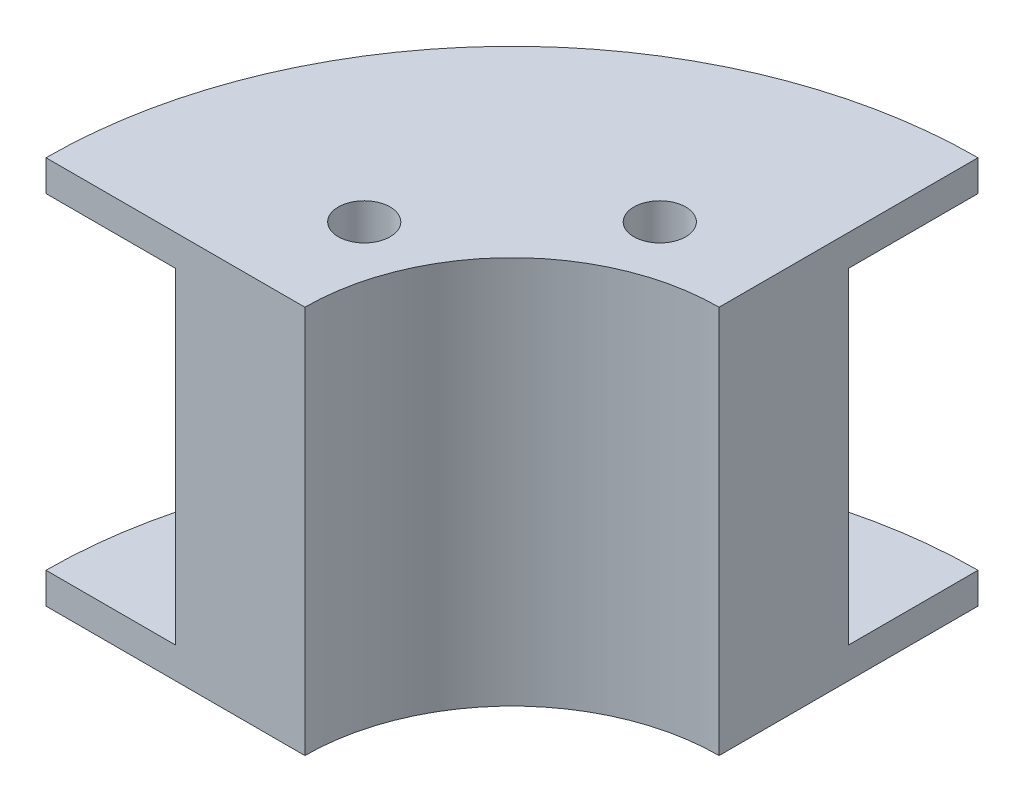
ISO-10303-21;
HEADER;
FILE_DESCRIPTION(('STEP AP214'),'2;1');
FILE_NAME('part.step','',(''),(''),'','','');
FILE_SCHEMA(('AUTOMOTIVE_DESIGN { 1 0 10303 214 1 1 1 1 }'));
ENDSEC;
DATA;
#1=APPLICATION_CONTEXT('core data for automotive mechanical design processes');
#2=APPLICATION_PROTOCOL_DEFINITION('international standard','automotive_design',2000,#1);
#3=PRODUCT_CONTEXT('',#1,'mechanical');
#4=PRODUCT('Part','Part','',(#3));
#5=PRODUCT_RELATED_PRODUCT_CATEGORY('part','',(#4));
#6=PRODUCT_DEFINITION_FORMATION('','',#4);
#7=PRODUCT_DEFINITION_CONTEXT('part definition',#1,'design');
#8=PRODUCT_DEFINITION('design','',#6,#7);
#9=PRODUCT_DEFINITION_SHAPE('','',#8);
#10=(LENGTH_UNIT() NAMED_UNIT(*) SI_UNIT(.MILLI.,.METRE.));
#11=(NAMED_UNIT(*) PLANE_ANGLE_UNIT() SI_UNIT($,.RADIAN.));
#12=(NAMED_UNIT(*) SI_UNIT($,.STERADIAN.) SOLID_ANGLE_UNIT());
#13=UNCERTAINTY_MEASURE_WITH_UNIT(LENGTH_MEASURE(1.E-05),#10,'distance_accuracy_value','');
#14=(GEOMETRIC_REPRESENTATION_CONTEXT(3) GLOBAL_UNCERTAINTY_ASSIGNED_CONTEXT((#13)) GLOBAL_UNIT_ASSIGNED_CONTEXT((#10,
#11,#12)) REPRESENTATION_CONTEXT('',''));
#15=CARTESIAN_POINT('',(0.,0.,0.));
#16=DIRECTION('',(0.,0.,1.));
#17=DIRECTION('',(1.,0.,0.));
#18=AXIS2_PLACEMENT_3D('',#15,#16,#17);
#19=CARTESIAN_POINT('',(13.,23.403849412725,0.));
#20=DIRECTION('',(0.,1.,0.));
#21=DIRECTION('',(-1.,0.,0.));
#22=AXIS2_PLACEMENT_3D('',#19,#20,#21);
#23=CYLINDRICAL_SURFACE('',#22,18.);
#24=CARTESIAN_POINT('',(13.,6.3,0.));
#25=DIRECTION('',(0.,1.,0.));
#26=DIRECTION('',(-1.,0.,0.));
#27=AXIS2_PLACEMENT_3D('',#24,#25,#26);
#28=CIRCLE('',#27,18.);
#29=CARTESIAN_POINT('',(13.0000000000001,6.3,-18.));
#30=VERTEX_POINT('',#29);
#31=CARTESIAN_POINT('',(-4.99999999999999,6.3,0.));
#32=VERTEX_POINT('',#31);
#33=EDGE_CURVE('E11',#30,#32,#28,.T.);
#34=ORIENTED_EDGE('',*,*,#33,.T.);
#35=DIRECTION('',(0.,-1.,0.));
#36=VECTOR('',#35,1.);
#37=CARTESIAN_POINT('',(-4.99999999999999,6.3,0.));
#38=LINE('',#37,#36);
#39=CARTESIAN_POINT('',(-4.99999999999999,7.5,0.));
#40=VERTEX_POINT('',#39);
#41=EDGE_CURVE('E93',#40,#32,#38,.T.);
#42=ORIENTED_EDGE('',*,*,#41,.F.);
#43=CARTESIAN_POINT('',(13.,7.5,0.));
#44=DIRECTION('',(0.,1.,0.));
#45=DIRECTION('',(-1.,0.,0.));
#46=AXIS2_PLACEMENT_3D('',#43,#44,#45);
#47=CIRCLE('',#46,18.);
#48=CARTESIAN_POINT('',(13.0000000000001,7.5,-18.));
#49=VERTEX_POINT('',#48);
#50=EDGE_CURVE('E44',#49,#40,#47,.T.);
#51=ORIENTED_EDGE('',*,*,#50,.F.);
#52=DIRECTION('',(0.,-1.,0.));
#53=VECTOR('',#52,1.);
#54=CARTESIAN_POINT('',(13.0000000000001,6.3,-18.));
#55=LINE('',#54,#53);
#56=EDGE_CURVE('E95',#49,#30,#55,.T.);
#57=ORIENTED_EDGE('',*,*,#56,.T.);
#58=EDGE_LOOP('',(#34,#42,#51,#57));
#59=FACE_BOUND('',#58,.T.);
#60=ADVANCED_FACE('F29',(#59),#23,.T.);
#61=CARTESIAN_POINT('',(13.,6.3,-13.));
#62=DIRECTION('',(0.,-1.,0.));
#63=DIRECTION('',(1.,0.,0.));
#64=AXIS2_PLACEMENT_3D('',#61,#62,#63);
#65=PLANE('',#64);
#66=CARTESIAN_POINT('',(13.,6.3,0.));
#67=DIRECTION('',(0.,1.,0.));
#68=DIRECTION('',(-1.,0.,0.));
#69=AXIS2_PLACEMENT_3D('',#66,#67,#68);
#70=CIRCLE('',#69,13.);
#71=CARTESIAN_POINT('',(13.,6.3,-13.));
#72=VERTEX_POINT('',#71);
#73=CARTESIAN_POINT('',(0.,6.3,0.));
#74=VERTEX_POINT('',#73);
#75=EDGE_CURVE('E37',#72,#74,#70,.T.);
#76=ORIENTED_EDGE('',*,*,#75,.T.);
#77=DIRECTION('',(1.,0.,0.));
#78=VECTOR('',#77,1.);
#79=CARTESIAN_POINT('',(0.,6.3,0.));
#80=LINE('',#79,#78);
#81=EDGE_CURVE('E104',#32,#74,#80,.T.);
#82=ORIENTED_EDGE('',*,*,#81,.F.);
#83=ORIENTED_EDGE('',*,*,#33,.F.);
#84=DIRECTION('',(0.,0.,1.));
#85=VECTOR('',#84,1.);
#86=CARTESIAN_POINT('',(13.,6.3,-13.));
#87=LINE('',#86,#85);
#88=EDGE_CURVE('E128',#30,#72,#87,.T.);
#89=ORIENTED_EDGE('',*,*,#88,.T.);
#90=EDGE_LOOP('',(#76,#82,#83,#89));
#91=FACE_BOUND('',#90,.T.);
#92=ADVANCED_FACE('F31',(#91),#65,.T.);
#93=CARTESIAN_POINT('',(13.,23.403849412725,0.));
#94=DIRECTION('',(0.,1.,0.));
#95=DIRECTION('',(-1.,0.,0.));
#96=AXIS2_PLACEMENT_3D('',#93,#94,#95);
#97=CYLINDRICAL_SURFACE('',#96,13.);
#98=CARTESIAN_POINT('',(13.,-6.29999999999999,0.));
#99=DIRECTION('',(0.,1.,0.));
#100=DIRECTION('',(-1.,0.,0.));
#101=AXIS2_PLACEMENT_3D('',#98,#99,#100);
#102=CIRCLE('',#101,13.);
#103=CARTESIAN_POINT('',(13.0000000000001,-6.29999999999999,-13.));
#104=VERTEX_POINT('',#103);
#105=CARTESIAN_POINT('',(0.,-6.3,0.));
#106=VERTEX_POINT('',#105);
#107=EDGE_CURVE('E154',#104,#106,#102,.T.);
#108=ORIENTED_EDGE('',*,*,#107,.T.);
#109=DIRECTION('',(0.,-1.,0.));
#110=VECTOR('',#109,1.);
#111=CARTESIAN_POINT('',(0.,-6.3,0.));
#112=LINE('',#111,#110);
#113=EDGE_CURVE('E110',#74,#106,#112,.T.);
#114=ORIENTED_EDGE('',*,*,#113,.F.);
#115=ORIENTED_EDGE('',*,*,#75,.F.);
#116=DIRECTION('',(0.,-1.,0.));
#117=VECTOR('',#116,1.);
#118=CARTESIAN_POINT('',(13.0000000000001,-6.29999999999999,-13.));
#119=LINE('',#118,#117);
#120=EDGE_CURVE('E130',#72,#104,#119,.T.);
#121=ORIENTED_EDGE('',*,*,#120,.T.);
#122=EDGE_LOOP('',(#108,#114,#115,#121));
#123=FACE_BOUND('',#122,.T.);
#124=ADVANCED_FACE('F156',(#123),#97,.T.);
#125=CARTESIAN_POINT('',(13.0000000000001,-6.29999999999999,-13.));
#126=DIRECTION('',(0.,1.,0.));
#127=DIRECTION('',(-1.,0.,0.));
#128=AXIS2_PLACEMENT_3D('',#125,#126,#127);
#129=PLANE('',#128);
#130=CARTESIAN_POINT('',(13.,-6.29999999999999,0.));
#131=DIRECTION('',(0.,1.,0.));
#132=DIRECTION('',(-1.,0.,0.));
#133=AXIS2_PLACEMENT_3D('',#130,#131,#132);
#134=CIRCLE('',#133,18.);
#135=CARTESIAN_POINT('',(13.0000000000001,-6.29999999999999,-18.));
#136=VERTEX_POINT('',#135);
#137=CARTESIAN_POINT('',(-4.99999999999999,-6.3,0.));
#138=VERTEX_POINT('',#137);
#139=EDGE_CURVE('E152',#136,#138,#134,.T.);
#140=ORIENTED_EDGE('',*,*,#139,.T.);
#141=DIRECTION('',(-1.,0.,0.));
#142=VECTOR('',#141,1.);
#143=CARTESIAN_POINT('',(0.,-6.3,0.));
#144=LINE('',#143,#142);
#145=EDGE_CURVE('E112',#106,#138,#144,.T.);
#146=ORIENTED_EDGE('',*,*,#145,.F.);
#147=ORIENTED_EDGE('',*,*,#107,.F.);
#148=DIRECTION('',(0.,0.,-1.));
#149=VECTOR('',#148,1.);
#150=CARTESIAN_POINT('',(13.0000000000001,-6.29999999999999,-13.));
#151=LINE('',#150,#149);
#152=EDGE_CURVE('E133',#104,#136,#151,.T.);
#153=ORIENTED_EDGE('',*,*,#152,.T.);
#154=EDGE_LOOP('',(#140,#146,#147,#153));
#155=FACE_BOUND('',#154,.T.);
#156=ADVANCED_FACE('F162',(#155),#129,.T.);
#157=CARTESIAN_POINT('',(13.,23.403849412725,0.));
#158=DIRECTION('',(0.,1.,0.));
#159=DIRECTION('',(-1.,0.,0.));
#160=AXIS2_PLACEMENT_3D('',#157,#158,#159);
#161=CYLINDRICAL_SURFACE('',#160,18.);
#162=CARTESIAN_POINT('',(13.,-7.49999999999999,0.));
#163=DIRECTION('',(0.,1.,0.));
#164=DIRECTION('',(-1.,0.,0.));
#165=AXIS2_PLACEMENT_3D('',#162,#163,#164);
#166=CIRCLE('',#165,18.);
#167=CARTESIAN_POINT('',(13.0000000000001,-7.49999999999999,-18.));
#168=VERTEX_POINT('',#167);
#169=CARTESIAN_POINT('',(-4.99999999999999,-7.5,0.));
#170=VERTEX_POINT('',#169);
#171=EDGE_CURVE('E150',#168,#170,#166,.T.);
#172=ORIENTED_EDGE('',*,*,#171,.T.);
#173=DIRECTION('',(0.,-1.,0.));
#174=VECTOR('',#173,1.);
#175=CARTESIAN_POINT('',(-4.99999999999999,-6.3,0.));
#176=LINE('',#175,#174);
#177=EDGE_CURVE('E118',#138,#170,#176,.T.);
#178=ORIENTED_EDGE('',*,*,#177,.F.);
#179=ORIENTED_EDGE('',*,*,#139,.F.);
#180=DIRECTION('',(0.,-1.,0.));
#181=VECTOR('',#180,1.);
#182=CARTESIAN_POINT('',(13.0000000000001,-6.29999999999999,-18.));
#183=LINE('',#182,#181);
#184=EDGE_CURVE('E136',#136,#168,#183,.T.);
#185=ORIENTED_EDGE('',*,*,#184,.T.);
#186=EDGE_LOOP('',(#172,#178,#179,#185));
#187=FACE_BOUND('',#186,.T.);
#188=ADVANCED_FACE('F165',(#187),#161,.T.);
#189=CARTESIAN_POINT('',(13.0000000000001,-7.5,-18.));
#190=DIRECTION('',(0.,-1.,0.));
#191=DIRECTION('',(1.,0.,0.));
#192=AXIS2_PLACEMENT_3D('',#189,#190,#191);
#193=PLANE('',#192);
#194=CARTESIAN_POINT('',(9.00000000000007,-7.5,-9.70824391947382));
#195=DIRECTION('',(0.,-1.,0.));
#196=DIRECTION('',(1.,0.,0.));
#197=AXIS2_PLACEMENT_3D('',#194,#195,#196);
#198=CIRCLE('',#197,1.);
#199=CARTESIAN_POINT('',(10.0000000000001,-7.5,-9.70824391947382));
#200=VERTEX_POINT('',#199);
#201=EDGE_CURVE('E255',#200,#200,#198,.T.);
#202=ORIENTED_EDGE('',*,*,#201,.F.);
#203=EDGE_LOOP('',(#202));
#204=FACE_BOUND('',#203,.T.);
#205=CARTESIAN_POINT('',(3.29175608052621,-7.5,-4.));
#206=DIRECTION('',(0.,-1.,0.));
#207=DIRECTION('',(1.,0.,0.));
#208=AXIS2_PLACEMENT_3D('',#205,#206,#207);
#209=CIRCLE('',#208,0.999999999999999);
#210=CARTESIAN_POINT('',(4.29175608052621,-7.5,-4.));
#211=VERTEX_POINT('',#210);
#212=EDGE_CURVE('E257',#211,#211,#209,.T.);
#213=ORIENTED_EDGE('',*,*,#212,.F.);
#214=EDGE_LOOP('',(#213));
#215=FACE_BOUND('',#214,.T.);
#216=CARTESIAN_POINT('',(13.,-7.5,0.));
#217=DIRECTION('',(0.,1.,0.));
#218=DIRECTION('',(-1.,0.,0.));
#219=AXIS2_PLACEMENT_3D('',#216,#217,#218);
#220=CIRCLE('',#219,8.);
#221=CARTESIAN_POINT('',(13.,-7.5,-8.));
#222=VERTEX_POINT('',#221);
#223=CARTESIAN_POINT('',(5.00000000000001,-7.5,0.));
#224=VERTEX_POINT('',#223);
#225=EDGE_CURVE('E148',#222,#224,#220,.T.);
#226=ORIENTED_EDGE('',*,*,#225,.T.);
#227=DIRECTION('',(1.,0.,0.));
#228=VECTOR('',#227,1.);
#229=CARTESIAN_POINT('',(-4.99999999999999,-7.5,0.));
#230=LINE('',#229,#228);
#231=EDGE_CURVE('E121',#170,#224,#230,.T.);
#232=ORIENTED_EDGE('',*,*,#231,.F.);
#233=ORIENTED_EDGE('',*,*,#171,.F.);
#234=DIRECTION('',(0.,0.,1.));
#235=VECTOR('',#234,1.);
#236=CARTESIAN_POINT('',(13.0000000000001,-7.49999999999999,-18.));
#237=LINE('',#236,#235);
#238=EDGE_CURVE('E139',#168,#222,#237,.T.);
#239=ORIENTED_EDGE('',*,*,#238,.T.);
#240=EDGE_LOOP('',(#226,#232,#233,#239));
#241=FACE_BOUND('',#240,.T.);
#242=ADVANCED_FACE('F170',(#204,#215,#241),#193,.T.);
#243=CARTESIAN_POINT('',(13.,23.403849412725,0.));
#244=DIRECTION('',(0.,1.,0.));
#245=DIRECTION('',(-1.,0.,0.));
#246=AXIS2_PLACEMENT_3D('',#243,#244,#245);
#247=CYLINDRICAL_SURFACE('',#246,8.);
#248=CARTESIAN_POINT('',(13.,7.5,0.));
#249=DIRECTION('',(0.,1.,0.));
#250=DIRECTION('',(-1.,0.,0.));
#251=AXIS2_PLACEMENT_3D('',#248,#249,#250);
#252=CIRCLE('',#251,8.);
#253=CARTESIAN_POINT('',(13.,7.5,-8.));
#254=VERTEX_POINT('',#253);
#255=CARTESIAN_POINT('',(5.00000000000001,7.5,0.));
#256=VERTEX_POINT('',#255);
#257=EDGE_CURVE('E52',#254,#256,#252,.T.);
#258=ORIENTED_EDGE('',*,*,#257,.T.);
#259=DIRECTION('',(0.,1.,0.));
#260=VECTOR('',#259,1.);
#261=CARTESIAN_POINT('',(5.00000000000001,7.5,0.));
#262=LINE('',#261,#260);
#263=EDGE_CURVE('E124',#224,#256,#262,.T.);
#264=ORIENTED_EDGE('',*,*,#263,.F.);
#265=ORIENTED_EDGE('',*,*,#225,.F.);
#266=DIRECTION('',(0.,1.,0.));
#267=VECTOR('',#266,1.);
#268=CARTESIAN_POINT('',(13.,7.5,-8.));
#269=LINE('',#268,#267);
#270=EDGE_CURVE('E142',#222,#254,#269,.T.);
#271=ORIENTED_EDGE('',*,*,#270,.T.);
#272=EDGE_LOOP('',(#258,#264,#265,#271));
#273=FACE_BOUND('',#272,.T.);
#274=ADVANCED_FACE('F173',(#273),#247,.F.);
#275=CARTESIAN_POINT('',(13.0000000000001,7.5,-18.));
#276=DIRECTION('',(0.,1.,0.));
#277=DIRECTION('',(-1.,0.,0.));
#278=AXIS2_PLACEMENT_3D('',#275,#276,#277);
#279=PLANE('',#278);
#280=CARTESIAN_POINT('',(9.00000000000007,7.50000000000001,-9.70824391947382));
#281=DIRECTION('',(0.,-1.,0.));
#282=DIRECTION('',(1.,0.,0.));
#283=AXIS2_PLACEMENT_3D('',#280,#281,#282);
#284=CIRCLE('',#283,1.);
#285=CARTESIAN_POINT('',(10.0000000000001,7.50000000000001,-9.70824391947382));
#286=VERTEX_POINT('',#285);
#287=EDGE_CURVE('E252',#286,#286,#284,.T.);
#288=ORIENTED_EDGE('',*,*,#287,.T.);
#289=EDGE_LOOP('',(#288));
#290=FACE_BOUND('',#289,.T.);
#291=CARTESIAN_POINT('',(3.29175608052621,7.50000000000001,-4.));
#292=DIRECTION('',(0.,-1.,0.));
#293=DIRECTION('',(1.,0.,0.));
#294=AXIS2_PLACEMENT_3D('',#291,#292,#293);
#295=CIRCLE('',#294,0.999999999999999);
#296=CARTESIAN_POINT('',(4.29175608052621,7.50000000000001,-4.));
#297=VERTEX_POINT('',#296);
#298=EDGE_CURVE('E108',#297,#297,#295,.T.);
#299=ORIENTED_EDGE('',*,*,#298,.T.);
#300=EDGE_LOOP('',(#299));
#301=FACE_BOUND('',#300,.T.);
#302=DIRECTION('',(0.,0.,-1.));
#303=VECTOR('',#302,1.);
#304=CARTESIAN_POINT('',(13.0000000000001,7.5,-18.));
#305=LINE('',#304,#303);
#306=EDGE_CURVE('E144',#254,#49,#305,.T.);
#307=ORIENTED_EDGE('',*,*,#306,.T.);
#308=ORIENTED_EDGE('',*,*,#50,.T.);
#309=DIRECTION('',(-1.,0.,0.));
#310=VECTOR('',#309,1.);
#311=CARTESIAN_POINT('',(-4.99999999999999,7.5,0.));
#312=LINE('',#311,#310);
#313=EDGE_CURVE('E107',#256,#40,#312,.T.);
#314=ORIENTED_EDGE('',*,*,#313,.F.);
#315=ORIENTED_EDGE('',*,*,#257,.F.);
#316=EDGE_LOOP('',(#307,#308,#314,#315));
#317=FACE_BOUND('',#316,.T.);
#318=ADVANCED_FACE('F175',(#290,#301,#317),#279,.T.);
#319=CARTESIAN_POINT('',(13.0000000000001,-6.29999999999999,-18.));
#320=DIRECTION('',(-1.,0.,0.));
#321=DIRECTION('',(0.,0.,1.));
#322=AXIS2_PLACEMENT_3D('',#319,#320,#321);
#323=PLANE('',#322);
#324=ORIENTED_EDGE('',*,*,#56,.F.);
#325=ORIENTED_EDGE('',*,*,#306,.F.);
#326=ORIENTED_EDGE('',*,*,#270,.F.);
#327=ORIENTED_EDGE('',*,*,#238,.F.);
#328=ORIENTED_EDGE('',*,*,#184,.F.);
#329=ORIENTED_EDGE('',*,*,#152,.F.);
#330=ORIENTED_EDGE('',*,*,#120,.F.);
#331=ORIENTED_EDGE('',*,*,#88,.F.);
#332=EDGE_LOOP('',(#324,#325,#326,#327,#328,#329,#330,#331));
#333=FACE_BOUND('',#332,.T.);
#334=ADVANCED_FACE('F177',(#333),#323,.F.);
#335=CARTESIAN_POINT('',(-4.99999999999999,-6.3,0.));
#336=DIRECTION('',(0.,0.,1.));
#337=DIRECTION('',(1.,0.,0.));
#338=AXIS2_PLACEMENT_3D('',#335,#336,#337);
#339=PLANE('',#338);
#340=ORIENTED_EDGE('',*,*,#41,.T.);
#341=ORIENTED_EDGE('',*,*,#81,.T.);
#342=ORIENTED_EDGE('',*,*,#113,.T.);
#343=ORIENTED_EDGE('',*,*,#145,.T.);
#344=ORIENTED_EDGE('',*,*,#177,.T.);
#345=ORIENTED_EDGE('',*,*,#231,.T.);
#346=ORIENTED_EDGE('',*,*,#263,.T.);
#347=ORIENTED_EDGE('',*,*,#313,.T.);
#348=EDGE_LOOP('',(#340,#341,#342,#343,#344,#345,#346,#347));
#349=FACE_BOUND('',#348,.T.);
#350=ADVANCED_FACE('F102',(#349),#339,.T.);
#351=CARTESIAN_POINT('',(3.29175608052621,7.50000000000001,-4.));
#352=DIRECTION('',(0.,-1.,0.));
#353=DIRECTION('',(1.,0.,0.));
#354=AXIS2_PLACEMENT_3D('',#351,#352,#353);
#355=CYLINDRICAL_SURFACE('',#354,0.999999999999999);
#356=CARTESIAN_POINT('',(4.29175608052621,7.50000000000001,-4.));
#357=CARTESIAN_POINT('',(4.29175608052621,7.34375,-4.));
#358=CARTESIAN_POINT('',(4.29175608052621,7.18750000000001,-4.));
#359=CARTESIAN_POINT('',(4.29175608052621,6.87500000000001,-4.));
#360=CARTESIAN_POINT('',(4.29175608052621,6.71875000000001,-4.));
#361=CARTESIAN_POINT('',(4.29175608052621,6.40625,-4.));
#362=CARTESIAN_POINT('',(4.29175608052621,6.25000000000001,-4.));
#363=CARTESIAN_POINT('',(4.29175608052621,5.93750000000001,-4.));
#364=CARTESIAN_POINT('',(4.29175608052621,5.78125000000001,-4.));
#365=CARTESIAN_POINT('',(4.29175608052621,5.46875,-4.));
#366=CARTESIAN_POINT('',(4.29175608052621,5.31250000000001,-4.));
#367=CARTESIAN_POINT('',(4.29175608052621,5.00000000000001,-4.));
#368=CARTESIAN_POINT('',(4.29175608052621,4.84375000000001,-4.));
#369=CARTESIAN_POINT('',(4.29175608052621,4.53125000000001,-4.));
#370=CARTESIAN_POINT('',(4.29175608052621,4.37500000000001,-4.));
#371=CARTESIAN_POINT('',(4.29175608052621,4.06250000000001,-4.));
#372=CARTESIAN_POINT('',(4.29175608052621,3.90625000000001,-4.));
#373=CARTESIAN_POINT('',(4.29175608052621,3.59375,-4.));
#374=CARTESIAN_POINT('',(4.29175608052621,3.4375,-4.));
#375=CARTESIAN_POINT('',(4.29175608052621,3.125,-4.));
#376=CARTESIAN_POINT('',(4.29175608052621,2.96875,-4.));
#377=CARTESIAN_POINT('',(4.29175608052621,2.65625,-4.));
#378=CARTESIAN_POINT('',(4.29175608052621,2.5,-4.));
#379=CARTESIAN_POINT('',(4.29175608052621,2.1875,-4.));
#380=CARTESIAN_POINT('',(4.29175608052621,2.03125,-4.));
#381=CARTESIAN_POINT('',(4.29175608052621,1.71875,-4.));
#382=CARTESIAN_POINT('',(4.29175608052621,1.5625,-4.));
#383=CARTESIAN_POINT('',(4.29175608052621,1.25,-4.));
#384=CARTESIAN_POINT('',(4.29175608052621,1.09375,-4.));
#385=CARTESIAN_POINT('',(4.29175608052621,0.781250000000004,-4.));
#386=CARTESIAN_POINT('',(4.29175608052621,0.625000000000005,-4.));
#387=CARTESIAN_POINT('',(4.29175608052621,0.312500000000005,-4.));
#388=CARTESIAN_POINT('',(4.29175608052621,0.156250000000004,-4.));
#389=CARTESIAN_POINT('',(4.29175608052621,-0.156249999999995,-4.));
#390=CARTESIAN_POINT('',(4.29175608052621,-0.312499999999995,-4.));
#391=CARTESIAN_POINT('',(4.29175608052621,-0.624999999999995,-4.));
#392=CARTESIAN_POINT('',(4.29175608052621,-0.781249999999995,-4.));
#393=CARTESIAN_POINT('',(4.29175608052621,-1.09375,-4.));
#394=CARTESIAN_POINT('',(4.29175608052621,-1.24999999999999,-4.));
#395=CARTESIAN_POINT('',(4.29175608052621,-1.56249999999999,-4.));
#396=CARTESIAN_POINT('',(4.29175608052621,-1.71874999999999,-4.));
#397=CARTESIAN_POINT('',(4.29175608052621,-2.03124999999999,-4.));
#398=CARTESIAN_POINT('',(4.29175608052621,-2.1875,-4.));
#399=CARTESIAN_POINT('',(4.29175608052621,-2.5,-4.));
#400=CARTESIAN_POINT('',(4.29175608052621,-2.65625,-4.));
#401=CARTESIAN_POINT('',(4.29175608052621,-2.96875,-4.));
#402=CARTESIAN_POINT('',(4.29175608052621,-3.125,-4.));
#403=CARTESIAN_POINT('',(4.29175608052621,-3.4375,-4.));
#404=CARTESIAN_POINT('',(4.29175608052621,-3.59375,-4.));
#405=CARTESIAN_POINT('',(4.29175608052621,-3.90625,-4.));
#406=CARTESIAN_POINT('',(4.29175608052621,-4.0625,-4.));
#407=CARTESIAN_POINT('',(4.29175608052621,-4.375,-4.));
#408=CARTESIAN_POINT('',(4.29175608052621,-4.53125,-4.));
#409=CARTESIAN_POINT('',(4.29175608052621,-4.84375,-4.));
#410=CARTESIAN_POINT('',(4.29175608052621,-5.,-4.));
#411=CARTESIAN_POINT('',(4.29175608052621,-5.3125,-4.));
#412=CARTESIAN_POINT('',(4.29175608052621,-5.46875,-4.));
#413=CARTESIAN_POINT('',(4.29175608052621,-5.78125,-4.));
#414=CARTESIAN_POINT('',(4.29175608052621,-5.9375,-4.));
#415=CARTESIAN_POINT('',(4.29175608052621,-6.25,-4.));
#416=CARTESIAN_POINT('',(4.29175608052621,-6.40625,-4.));
#417=CARTESIAN_POINT('',(4.29175608052621,-6.71875,-4.));
#418=CARTESIAN_POINT('',(4.29175608052621,-6.875,-4.));
#419=CARTESIAN_POINT('',(4.29175608052621,-7.1875,-4.));
#420=CARTESIAN_POINT('',(4.29175608052621,-7.34375,-4.));
#421=CARTESIAN_POINT('',(4.29175608052621,-7.5,-4.));
#422=B_SPLINE_CURVE_WITH_KNOTS('',3,(#356,#357,#358,#359,#360,#361,#362,#363,#364,#365,#366,
#367,#368,#369,#370,#371,#372,#373,#374,#375,#376,#377,#378,#379,#380,#381,#382,#383,#384,#385,
#386,#387,#388,#389,#390,#391,#392,#393,#394,#395,#396,#397,#398,#399,#400,#401,#402,#403,#404,
#405,#406,#407,#408,#409,#410,#411,#412,#413,#414,#415,#416,#417,#418,#419,#420,#421),
.UNSPECIFIED.,.F.,.F.,(4,2,2,2,2,2,2,2,2,2,2,2,2,2,2,2,2,2,2,2,2,2,2,2,2,2,2,2,2,2,2,2,4),(0.,
0.46875,0.9375,1.40625,1.875,2.34375,2.8125,3.28125,3.75,4.21875,4.6875,5.15625,5.625,6.09375,
6.5625,7.03125,7.5,7.96875,8.4375,8.90625,9.375,9.84375,10.3125,10.78125,11.25,11.71875,12.1875,
12.65625,13.125,13.59375,14.0625,14.53125,15.),.UNSPECIFIED.);
#423=EDGE_CURVE('BSEAM184',#297,#211,#422,.T.);
#424=ORIENTED_EDGE('',*,*,#298,.F.);
#425=ORIENTED_EDGE('',*,*,#212,.T.);
#426=ORIENTED_EDGE('',*,*,#423,.T.);
#427=ORIENTED_EDGE('',*,*,#423,.F.);
#428=EDGE_LOOP('',(#424,#426,#425,#427));
#429=FACE_BOUND('',#428,.T.);
#430=ADVANCED_FACE('F184',(#429),#355,.F.);
#431=CARTESIAN_POINT('',(9.00000000000007,7.50000000000001,-9.70824391947382));
#432=DIRECTION('',(0.,-1.,0.));
#433=DIRECTION('',(1.,0.,0.));
#434=AXIS2_PLACEMENT_3D('',#431,#432,#433);
#435=CYLINDRICAL_SURFACE('',#434,1.);
#436=CARTESIAN_POINT('',(10.0000000000001,7.50000000000001,-9.70824391947382));
#437=CARTESIAN_POINT('',(10.0000000000001,7.34375000000001,-9.70824391947382));
#438=CARTESIAN_POINT('',(10.0000000000001,7.18750000000001,-9.70824391947382));
#439=CARTESIAN_POINT('',(10.0000000000001,6.87500000000001,-9.70824391947382));
#440=CARTESIAN_POINT('',(10.0000000000001,6.71875000000001,-9.70824391947382));
#441=CARTESIAN_POINT('',(10.0000000000001,6.40625000000001,-9.70824391947382));
#442=CARTESIAN_POINT('',(10.0000000000001,6.25000000000001,-9.70824391947382));
#443=CARTESIAN_POINT('',(10.0000000000001,5.93750000000001,-9.70824391947382));
#444=CARTESIAN_POINT('',(10.0000000000001,5.78125000000001,-9.70824391947382));
#445=CARTESIAN_POINT('',(10.0000000000001,5.46875000000001,-9.70824391947382));
#446=CARTESIAN_POINT('',(10.0000000000001,5.31250000000001,-9.70824391947382));
#447=CARTESIAN_POINT('',(10.0000000000001,5.00000000000001,-9.70824391947382));
#448=CARTESIAN_POINT('',(10.0000000000001,4.84375000000001,-9.70824391947382));
#449=CARTESIAN_POINT('',(10.0000000000001,4.53125000000001,-9.70824391947382));
#450=CARTESIAN_POINT('',(10.0000000000001,4.37500000000001,-9.70824391947382));
#451=CARTESIAN_POINT('',(10.0000000000001,4.06250000000001,-9.70824391947382));
#452=CARTESIAN_POINT('',(10.0000000000001,3.90625000000001,-9.70824391947382));
#453=CARTESIAN_POINT('',(10.0000000000001,3.59375000000001,-9.70824391947382));
#454=CARTESIAN_POINT('',(10.0000000000001,3.43750000000001,-9.70824391947382));
#455=CARTESIAN_POINT('',(10.0000000000001,3.12500000000001,-9.70824391947382));
#456=CARTESIAN_POINT('',(10.0000000000001,2.96875000000001,-9.70824391947382));
#457=CARTESIAN_POINT('',(10.0000000000001,2.65625000000001,-9.70824391947382));
#458=CARTESIAN_POINT('',(10.0000000000001,2.50000000000001,-9.70824391947382));
#459=CARTESIAN_POINT('',(10.0000000000001,2.18750000000001,-9.70824391947382));
#460=CARTESIAN_POINT('',(10.0000000000001,2.03125000000001,-9.70824391947382));
#461=CARTESIAN_POINT('',(10.0000000000001,1.71875000000001,-9.70824391947382));
#462=CARTESIAN_POINT('',(10.0000000000001,1.56250000000001,-9.70824391947382));
#463=CARTESIAN_POINT('',(10.0000000000001,1.25000000000001,-9.70824391947382));
#464=CARTESIAN_POINT('',(10.0000000000001,1.09375000000001,-9.70824391947382));
#465=CARTESIAN_POINT('',(10.0000000000001,0.781250000000005,-9.70824391947382));
#466=CARTESIAN_POINT('',(10.0000000000001,0.625000000000005,-9.70824391947382));
#467=CARTESIAN_POINT('',(10.0000000000001,0.312500000000005,-9.70824391947382));
#468=CARTESIAN_POINT('',(10.0000000000001,0.156250000000005,-9.70824391947382));
#469=CARTESIAN_POINT('',(10.0000000000001,-0.156249999999995,-9.70824391947382));
#470=CARTESIAN_POINT('',(10.0000000000001,-0.312499999999995,-9.70824391947382));
#471=CARTESIAN_POINT('',(10.0000000000001,-0.624999999999994,-9.70824391947382));
#472=CARTESIAN_POINT('',(10.0000000000001,-0.781249999999995,-9.70824391947382));
#473=CARTESIAN_POINT('',(10.0000000000001,-1.09374999999999,-9.70824391947382));
#474=CARTESIAN_POINT('',(10.0000000000001,-1.24999999999999,-9.70824391947382));
#475=CARTESIAN_POINT('',(10.0000000000001,-1.56249999999999,-9.70824391947382));
#476=CARTESIAN_POINT('',(10.0000000000001,-1.71874999999999,-9.70824391947382));
#477=CARTESIAN_POINT('',(10.0000000000001,-2.03124999999999,-9.70824391947382));
#478=CARTESIAN_POINT('',(10.0000000000001,-2.18749999999999,-9.70824391947382));
#479=CARTESIAN_POINT('',(10.0000000000001,-2.49999999999999,-9.70824391947382));
#480=CARTESIAN_POINT('',(10.0000000000001,-2.65624999999999,-9.70824391947382));
#481=CARTESIAN_POINT('',(10.0000000000001,-2.96874999999999,-9.70824391947382));
#482=CARTESIAN_POINT('',(10.0000000000001,-3.125,-9.70824391947382));
#483=CARTESIAN_POINT('',(10.0000000000001,-3.4375,-9.70824391947382));
#484=CARTESIAN_POINT('',(10.0000000000001,-3.59375,-9.70824391947382));
#485=CARTESIAN_POINT('',(10.0000000000001,-3.90625,-9.70824391947382));
#486=CARTESIAN_POINT('',(10.0000000000001,-4.06249999999999,-9.70824391947382));
#487=CARTESIAN_POINT('',(10.0000000000001,-4.37499999999999,-9.70824391947382));
#488=CARTESIAN_POINT('',(10.0000000000001,-4.53124999999999,-9.70824391947382));
#489=CARTESIAN_POINT('',(10.0000000000001,-4.84374999999999,-9.70824391947382));
#490=CARTESIAN_POINT('',(10.0000000000001,-4.99999999999999,-9.70824391947382));
#491=CARTESIAN_POINT('',(10.0000000000001,-5.3125,-9.70824391947382));
#492=CARTESIAN_POINT('',(10.0000000000001,-5.46875,-9.70824391947382));
#493=CARTESIAN_POINT('',(10.0000000000001,-5.78125,-9.70824391947382));
#494=CARTESIAN_POINT('',(10.0000000000001,-5.9375,-9.70824391947382));
#495=CARTESIAN_POINT('',(10.0000000000001,-6.25,-9.70824391947382));
#496=CARTESIAN_POINT('',(10.0000000000001,-6.40625,-9.70824391947382));
#497=CARTESIAN_POINT('',(10.0000000000001,-6.71874999999999,-9.70824391947382));
#498=CARTESIAN_POINT('',(10.0000000000001,-6.87499999999999,-9.70824391947382));
#499=CARTESIAN_POINT('',(10.0000000000001,-7.18749999999999,-9.70824391947382));
#500=CARTESIAN_POINT('',(10.0000000000001,-7.34375,-9.70824391947382));
#501=CARTESIAN_POINT('',(10.0000000000001,-7.5,-9.70824391947382));
#502=B_SPLINE_CURVE_WITH_KNOTS('',3,(#436,#437,#438,#439,#440,#441,#442,#443,#444,#445,#446,
#447,#448,#449,#450,#451,#452,#453,#454,#455,#456,#457,#458,#459,#460,#461,#462,#463,#464,#465,
#466,#467,#468,#469,#470,#471,#472,#473,#474,#475,#476,#477,#478,#479,#480,#481,#482,#483,#484,
#485,#486,#487,#488,#489,#490,#491,#492,#493,#494,#495,#496,#497,#498,#499,#500,#501),
.UNSPECIFIED.,.F.,.F.,(4,2,2,2,2,2,2,2,2,2,2,2,2,2,2,2,2,2,2,2,2,2,2,2,2,2,2,2,2,2,2,2,4),(0.,
0.46875,0.9375,1.40625,1.875,2.34375,2.8125,3.28125,3.75,4.21875,4.6875,5.15625,5.625,6.09375,
6.5625,7.03125,7.5,7.96875,8.4375,8.90625,9.375,9.84375,10.3125,10.78125,11.25,11.71875,12.1875,
12.65625,13.125,13.59375,14.0625,14.53125,15.),.UNSPECIFIED.);
#503=EDGE_CURVE('BSEAM239',#286,#200,#502,.T.);
#504=ORIENTED_EDGE('',*,*,#287,.F.);
#505=ORIENTED_EDGE('',*,*,#201,.T.);
#506=ORIENTED_EDGE('',*,*,#503,.T.);
#507=ORIENTED_EDGE('',*,*,#503,.F.);
#508=EDGE_LOOP('',(#504,#506,#505,#507));
#509=FACE_BOUND('',#508,.T.);
#510=ADVANCED_FACE('F239',(#509),#435,.F.);
#511=CLOSED_SHELL('',(#60,#92,#124,#156,#188,#242,#274,#318,#334,#350,#430,#510));
#512=MANIFOLD_SOLID_BREP('B2',#511);
#513=ADVANCED_BREP_SHAPE_REPRESENTATION('',(#18,#512),#14);
#514=SHAPE_DEFINITION_REPRESENTATION(#9,#513);
ENDSEC;
END-ISO-10303-21;
